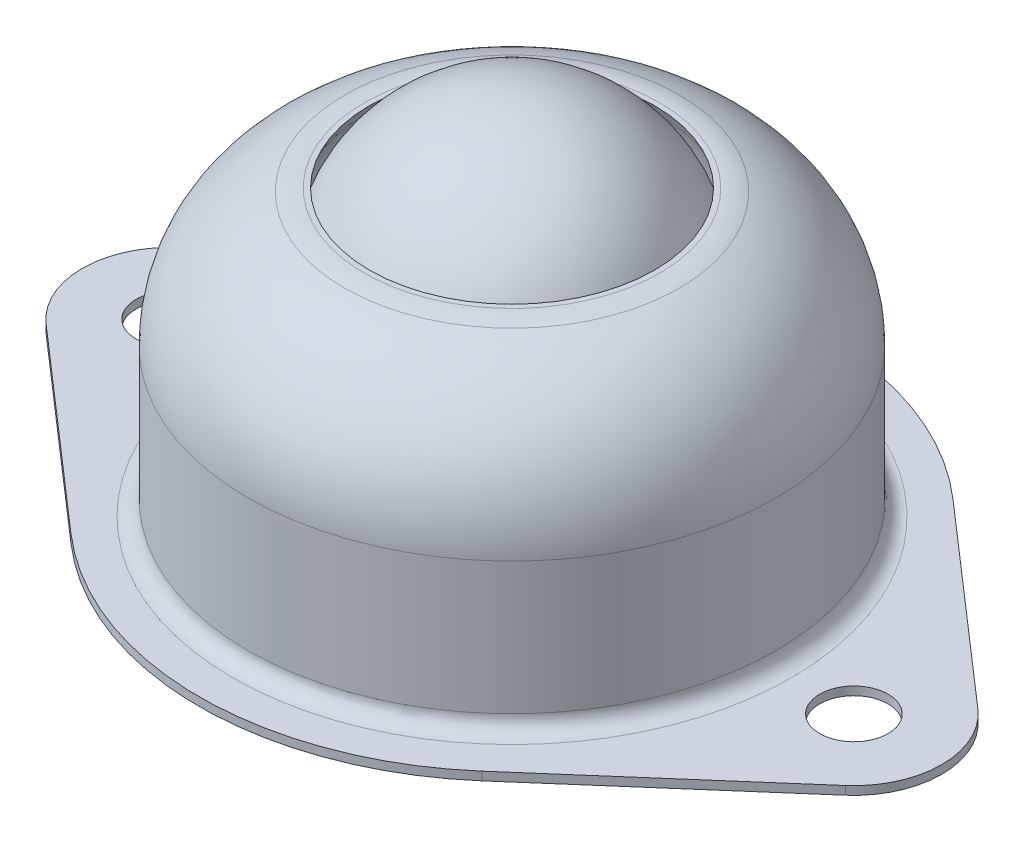
ISO-10303-21;
HEADER;
FILE_DESCRIPTION(('STEP AP214'),'2;1');
FILE_NAME('part.step','',(''),(''),'','','');
FILE_SCHEMA(('AUTOMOTIVE_DESIGN { 1 0 10303 214 1 1 1 1 }'));
ENDSEC;
DATA;
#1=APPLICATION_CONTEXT('core data for automotive mechanical design processes');
#2=APPLICATION_PROTOCOL_DEFINITION('international standard','automotive_design',2000,#1);
#3=PRODUCT_CONTEXT('',#1,'mechanical');
#4=PRODUCT('Part','Part','',(#3));
#5=PRODUCT_RELATED_PRODUCT_CATEGORY('part','',(#4));
#6=PRODUCT_DEFINITION_FORMATION('','',#4);
#7=PRODUCT_DEFINITION_CONTEXT('part definition',#1,'design');
#8=PRODUCT_DEFINITION('design','',#6,#7);
#9=PRODUCT_DEFINITION_SHAPE('','',#8);
#10=(LENGTH_UNIT() NAMED_UNIT(*) SI_UNIT(.MILLI.,.METRE.));
#11=(NAMED_UNIT(*) PLANE_ANGLE_UNIT() SI_UNIT($,.RADIAN.));
#12=(NAMED_UNIT(*) SI_UNIT($,.STERADIAN.) SOLID_ANGLE_UNIT());
#13=UNCERTAINTY_MEASURE_WITH_UNIT(LENGTH_MEASURE(1.E-05),#10,'distance_accuracy_value','');
#14=(GEOMETRIC_REPRESENTATION_CONTEXT(3) GLOBAL_UNCERTAINTY_ASSIGNED_CONTEXT((#13)) GLOBAL_UNIT_ASSIGNED_CONTEXT((#10,
#11,#12)) REPRESENTATION_CONTEXT('',''));
#15=CARTESIAN_POINT('',(0.,0.,0.));
#16=DIRECTION('',(0.,0.,1.));
#17=DIRECTION('',(1.,0.,0.));
#18=AXIS2_PLACEMENT_3D('',#15,#16,#17);
#19=CARTESIAN_POINT('',(0.,17.4625,0.));
#20=DIRECTION('',(0.,1.,0.));
#21=DIRECTION('',(1.,0.,0.));
#22=AXIS2_PLACEMENT_3D('',#19,#20,#21);
#23=SPHERICAL_SURFACE('',#22,13.208);
#24=CARTESIAN_POINT('',(0.,22.9209308176448,0.));
#25=DIRECTION('',(0.,1.,0.));
#26=DIRECTION('',(0.,0.,1.));
#27=AXIS2_PLACEMENT_3D('',#24,#25,#26);
#28=CIRCLE('',#27,12.0273354076863);
#29=CARTESIAN_POINT('',(12.0273354076863,22.9209308176448,0.));
#30=VERTEX_POINT('',#29);
#31=EDGE_CURVE('E72',#30,#30,#28,.T.);
#32=CARTESIAN_POINT('',(0.,4.31569947667876,0.));
#33=DIRECTION('',(0.,1.,0.));
#34=DIRECTION('',(0.,0.,1.));
#35=AXIS2_PLACEMENT_3D('',#32,#33,#34);
#36=CIRCLE('',#35,1.27);
#37=CARTESIAN_POINT('',(1.26999999999999,4.31569947667876,0.));
#38=VERTEX_POINT('',#37);
#39=EDGE_CURVE('E81',#38,#38,#36,.T.);
#40=CARTESIAN_POINT('',(12.0273354076863,22.9209308176448,0.));
#41=CARTESIAN_POINT('',(12.1354063074439,22.6828266231431,0.));
#42=CARTESIAN_POINT('',(12.2363884193767,22.4415063961473,0.));
#43=CARTESIAN_POINT('',(12.4238592792069,21.9533003307347,0.));
#44=CARTESIAN_POINT('',(12.5103480271044,21.7064144923179,0.));
#45=CARTESIAN_POINT('',(12.6685163704782,21.2079436576303,0.));
#46=CARTESIAN_POINT('',(12.7401959659545,20.9563586613596,0.));
#47=CARTESIAN_POINT('',(12.8684961325188,20.4493777941359,0.));
#48=CARTESIAN_POINT('',(12.9251167036067,20.1939819231829,0.));
#49=CARTESIAN_POINT('',(13.0230983831068,19.680279619073,0.));
#50=CARTESIAN_POINT('',(13.064459491519,19.4219731859161,0.));
#51=CARTESIAN_POINT('',(13.1317766005068,18.9033607110477,0.));
#52=CARTESIAN_POINT('',(13.1577326010825,18.6430546693362,0.));
#53=CARTESIAN_POINT('',(13.194147909286,18.1213608811198,0.));
#54=CARTESIAN_POINT('',(13.2046072169139,17.8599731346149,0.));
#55=CARTESIAN_POINT('',(13.2099922711641,17.3370376821296,0.));
#56=CARTESIAN_POINT('',(13.2049180177863,17.0754899761493,0.));
#57=CARTESIAN_POINT('',(13.1792538395225,16.5531569068375,0.));
#58=CARTESIAN_POINT('',(13.1586639146365,16.2923715435061,0.));
#59=CARTESIAN_POINT('',(13.1020410013077,15.7724827752907,0.));
#60=CARTESIAN_POINT('',(13.066008012865,15.5133793704066,0.));
#61=CARTESIAN_POINT('',(12.9786260363631,14.9977682032215,0.));
#62=CARTESIAN_POINT('',(12.9272770483038,14.7412604409204,0.));
#63=CARTESIAN_POINT('',(12.8094441461496,14.2317450900827,0.));
#64=CARTESIAN_POINT('',(12.7429602320547,13.9787375015462,0.));
#65=CARTESIAN_POINT('',(12.5950919220644,13.4771146866122,0.));
#66=CARTESIAN_POINT('',(12.5137075261689,13.2284994602148,0.));
#67=CARTESIAN_POINT('',(12.3363252408624,12.736538069023,0.));
#68=CARTESIAN_POINT('',(12.2403273514514,12.4931919042286,0.));
#69=CARTESIAN_POINT('',(12.0340565994001,12.0126267552514,0.));
#70=CARTESIAN_POINT('',(11.9237837367599,11.7754077710686,0.));
#71=CARTESIAN_POINT('',(11.6893518968121,11.3079334958597,0.));
#72=CARTESIAN_POINT('',(11.5651929195045,11.0776782048335,0.));
#73=CARTESIAN_POINT('',(11.3034266758137,10.6249432721992,0.));
#74=CARTESIAN_POINT('',(11.1658194094304,10.4024636305911,0.));
#75=CARTESIAN_POINT('',(10.877641836292,9.96606453354397,0.));
#76=CARTESIAN_POINT('',(10.727071529537,9.75214507810504,0.));
#77=CARTESIAN_POINT('',(10.4134988363238,9.33362070410242,0.));
#78=CARTESIAN_POINT('',(10.2504964498656,9.12901578553873,0.));
#79=CARTESIAN_POINT('',(9.91263439753766,8.72984198985492,0.));
#80=CARTESIAN_POINT('',(9.73777473166778,8.5352731127348,0.));
#81=CARTESIAN_POINT('',(9.37681473349268,8.15685751411455,0.));
#82=CARTESIAN_POINT('',(9.19071440118745,7.97301079261442,0.));
#83=CARTESIAN_POINT('',(8.80792932142758,7.61668780951829,0.));
#84=CARTESIAN_POINT('',(8.61124457397294,7.44421154792229,0.));
#85=CARTESIAN_POINT('',(8.20798423933021,7.11123769302188,0.));
#86=CARTESIAN_POINT('',(8.00140865214211,6.95074009971748,0.));
#87=CARTESIAN_POINT('',(7.57909509187895,6.64228954865901,0.));
#88=CARTESIAN_POINT('',(7.36335711880388,6.49433659090495,0.));
#89=CARTESIAN_POINT('',(6.9234795499887,6.21149704311178,0.));
#90=CARTESIAN_POINT('',(6.69933995424859,6.07661045307267,0.));
#91=CARTESIAN_POINT('',(6.2434495310656,5.82037929117924,0.));
#92=CARTESIAN_POINT('',(6.01169870362271,5.69903471932493,0.));
#93=CARTESIAN_POINT('',(5.54140304457322,5.4703155106555,0.));
#94=CARTESIAN_POINT('',(5.30285821296662,5.36294087384038,0.));
#95=CARTESIAN_POINT('',(4.81981574275874,5.16254011479224,0.));
#96=CARTESIAN_POINT('',(4.57531810415748,5.0695139925592,0.));
#97=CARTESIAN_POINT('',(4.08123216493327,4.89813852340909,0.));
#98=CARTESIAN_POINT('',(3.83164386431033,4.81978917649202,0.));
#99=CARTESIAN_POINT('',(3.32825686069129,4.67804272306628,0.));
#100=CARTESIAN_POINT('',(3.07445815769519,4.61464561655762,0.));
#101=CARTESIAN_POINT('',(2.56354484673523,4.50303026562589,0.));
#102=CARTESIAN_POINT('',(2.30643023877135,4.45481202120282,0.));
#103=CARTESIAN_POINT('',(1.78979358299367,4.37371299840943,0.));
#104=CARTESIAN_POINT('',(1.53027153517986,4.34083222003912,0.));
#105=CARTESIAN_POINT('',(1.26999999999999,4.31569947667876,0.));
#106=B_SPLINE_CURVE_WITH_KNOTS('',3,(#40,#41,#42,#43,#44,#45,#46,#47,#48,#49,#50,#51,#52,#53,
#54,#55,#56,#57,#58,#59,#60,#61,#62,#63,#64,#65,#66,#67,#68,#69,#70,#71,#72,#73,#74,#75,#76,#77,
#78,#79,#80,#81,#82,#83,#84,#85,#86,#87,#88,#89,#90,#91,#92,#93,#94,#95,#96,#97,#98,#99,#100,
#101,#102,#103,#104,#105),.UNSPECIFIED.,.F.,.F.,(4,2,2,2,2,2,2,2,2,2,2,2,2,2,2,2,2,2,2,2,2,2,2,
2,2,2,2,2,2,2,2,2,4),(0.,0.784329533650566,1.56865906730113,2.3529886009517,3.13731813460227,
3.92164766825284,4.70597720190341,5.49030673555397,6.27463626920454,7.05896580285511,
7.84329533650568,8.62762487015624,9.41195440380681,10.1962839374574,10.9806134711079,
11.7649430047585,12.5492725384091,13.3336020720596,14.1179316057102,14.9022611393608,
15.6865906730114,16.4709202066619,17.2552497403125,18.0395792739631,18.8239088076136,
19.6082383412642,20.3925678749148,21.1768974085653,21.9612269422159,22.7455564758665,
23.529886009517,24.3142155431676,25.0985450768182),.UNSPECIFIED.);
#107=EDGE_CURVE('BSEAM52',#30,#38,#106,.T.);
#108=ORIENTED_EDGE('',*,*,#31,.T.);
#109=ORIENTED_EDGE('',*,*,#39,.F.);
#110=ORIENTED_EDGE('',*,*,#107,.T.);
#111=ORIENTED_EDGE('',*,*,#107,.F.);
#112=EDGE_LOOP('',(#108,#110,#109,#111));
#113=FACE_BOUND('',#112,.T.);
#114=ADVANCED_FACE('F52',(#113),#23,.F.);
#115=CARTESIAN_POINT('',(0.,17.4625,0.));
#116=DIRECTION('',(0.,1.,0.));
#117=DIRECTION('',(-1.,0.,0.));
#118=AXIS2_PLACEMENT_3D('',#115,#116,#117);
#119=SPHERICAL_SURFACE('',#118,13.8938);
#120=CARTESIAN_POINT('',(0.,16.2531747527013,0.));
#121=DIRECTION('',(0.,1.,0.));
#122=DIRECTION('',(0.,0.,1.));
#123=AXIS2_PLACEMENT_3D('',#120,#121,#122);
#124=CIRCLE('',#123,13.841069716111);
#125=CARTESIAN_POINT('',(-13.841069716111,16.2531747527013,0.));
#126=VERTEX_POINT('',#125);
#127=EDGE_CURVE('E14',#126,#126,#124,.F.);
#128=CARTESIAN_POINT('',(0.,3.626865629289,0.));
#129=DIRECTION('',(0.,1.,0.));
#130=DIRECTION('',(0.,0.,1.));
#131=AXIS2_PLACEMENT_3D('',#128,#129,#130);
#132=CIRCLE('',#131,1.27);
#133=CARTESIAN_POINT('',(-1.26999999999999,3.626865629289,0.));
#134=VERTEX_POINT('',#133);
#135=EDGE_CURVE('E56',#134,#134,#132,.F.);
#136=CARTESIAN_POINT('',(-13.841069716111,16.2531747527013,0.));
#137=CARTESIAN_POINT('',(-13.8235360683736,16.052463004573,0.));
#138=CARTESIAN_POINT('',(-13.8016308000787,15.8521334399351,0.));
#139=CARTESIAN_POINT('',(-13.7491314395764,15.4526160474631,0.));
#140=CARTESIAN_POINT('',(-13.7185373473692,15.253428219629,0.));
#141=CARTESIAN_POINT('',(-13.6487147562452,14.8565716705877,0.));
#142=CARTESIAN_POINT('',(-13.6094862573285,14.6589029493804,0.));
#143=CARTESIAN_POINT('',(-13.5224700139171,14.2654585299939,0.));
#144=CARTESIAN_POINT('',(-13.4746822694224,14.0696828318147,0.));
#145=CARTESIAN_POINT('',(-13.3706377117815,13.6803949479255,0.));
#146=CARTESIAN_POINT('',(-13.3143808986352,13.4868827622155,0.));
#147=CARTESIAN_POINT('',(-13.1935047225155,13.1024880680105,0.));
#148=CARTESIAN_POINT('',(-13.128885359542,12.9116055595156,0.));
#149=CARTESIAN_POINT('',(-12.9914063418791,12.5328314196153,0.));
#150=CARTESIAN_POINT('',(-12.9185466871896,12.34493978821,0.));
#151=CARTESIAN_POINT('',(-12.7647249596114,11.9725029398908,0.));
#152=CARTESIAN_POINT('',(-12.6837628867227,11.7879577229769,0.));
#153=CARTESIAN_POINT('',(-12.5138895219825,11.4225629095876,0.));
#154=CARTESIAN_POINT('',(-12.424978230131,11.2417133131122,0.));
#155=CARTESIAN_POINT('',(-12.2393746702459,10.8840519532928,0.));
#156=CARTESIAN_POINT('',(-12.1426824022123,10.7072401899489,0.));
#157=CARTESIAN_POINT('',(-11.9416998558625,10.3579890685513,0.));
#158=CARTESIAN_POINT('',(-11.8374095775463,10.1855497104977,0.));
#159=CARTESIAN_POINT('',(-11.621428353987,9.84536969813801,0.));
#160=CARTESIAN_POINT('',(-11.5097374087438,9.67762904383196,0.));
#161=CARTESIAN_POINT('',(-11.2791661985701,9.34716384630439,0.));
#162=CARTESIAN_POINT('',(-11.1602859336395,9.18443930308288,0.));
#163=CARTESIAN_POINT('',(-10.9155610353331,8.86431424332153,0.));
#164=CARTESIAN_POINT('',(-10.7897164019572,8.70691372678169,0.));
#165=CARTESIAN_POINT('',(-10.5313008963293,8.39773456158905,0.));
#166=CARTESIAN_POINT('',(-10.3987300240772,8.24595591293624,0.));
#167=CARTESIAN_POINT('',(-10.1271128979956,7.9483076867406,0.));
#168=CARTESIAN_POINT('',(-9.98806664416616,7.80243810919777,0.));
#169=CARTESIAN_POINT('',(-9.70376186527229,7.51688404700234,0.));
#170=CARTESIAN_POINT('',(-9.55850334020791,7.37719956234975,0.));
#171=CARTESIAN_POINT('',(-9.26204888436017,7.10428000396994,0.));
#172=CARTESIAN_POINT('',(-9.1108529535768,6.97104493024272,0.));
#173=CARTESIAN_POINT('',(-8.80280978686588,6.71127630784794,0.));
#174=CARTESIAN_POINT('',(-8.64596255093832,6.58474275918037,0.));
#175=CARTESIAN_POINT('',(-8.32691356819881,6.33861662007447,0.));
#176=CARTESIAN_POINT('',(-8.16471182138687,6.21902402963613,0.));
#177=CARTESIAN_POINT('',(-7.83526074321399,5.98700610612886,0.));
#178=CARTESIAN_POINT('',(-7.66801141185305,5.87458077305992,0.));
#179=CARTESIAN_POINT('',(-7.32878164221306,5.65711010117693,0.));
#180=CARTESIAN_POINT('',(-7.15680120393401,5.55206476236288,0.));
#181=CARTESIAN_POINT('',(-6.80843465052383,5.3495528511087,0.));
#182=CARTESIAN_POINT('',(-6.6320485353927,5.25208627866857,0.));
#183=CARTESIAN_POINT('',(-6.27520439500448,5.06491633123989,0.));
#184=CARTESIAN_POINT('',(-6.0947463697474,4.97521295625132,0.));
#185=CARTESIAN_POINT('',(-5.73009988084804,4.8037391453258,0.));
#186=CARTESIAN_POINT('',(-5.54591141720576,4.72196870938884,0.));
#187=CARTESIAN_POINT('',(-5.17415258242203,4.56651550542922,0.));
#188=CARTESIAN_POINT('',(-4.98658221128058,4.49283273740656,0.));
#189=CARTESIAN_POINT('',(-4.60841449097444,4.353694300326,0.));
#190=CARTESIAN_POINT('',(-4.41781714180974,4.28823863126809,0.));
#191=CARTESIAN_POINT('',(-4.03395612581727,4.16567823273946,0.));
#192=CARTESIAN_POINT('',(-3.8406924589895,4.10857350326875,0.));
#193=CARTESIAN_POINT('',(-3.45186450186384,4.00282310716967,0.));
#194=CARTESIAN_POINT('',(-3.25630021156596,3.95417744054131,0.));
#195=CARTESIAN_POINT('',(-2.86324109799787,3.8654369706031,0.));
#196=CARTESIAN_POINT('',(-2.66574627472766,3.82534216729326,0.));
#197=CARTESIAN_POINT('',(-2.26919967847707,3.75378022384315,0.));
#198=CARTESIAN_POINT('',(-2.07014790549668,3.72231308370289,0.));
#199=CARTESIAN_POINT('',(-1.67086453742834,3.66806253785535,0.));
#200=CARTESIAN_POINT('',(-1.47063294234039,3.64527913214808,0.));
#201=CARTESIAN_POINT('',(-1.26999999999999,3.626865629289,0.));
#202=B_SPLINE_CURVE_WITH_KNOTS('',3,(#136,#137,#138,#139,#140,#141,#142,#143,#144,#145,#146,
#147,#148,#149,#150,#151,#152,#153,#154,#155,#156,#157,#158,#159,#160,#161,#162,#163,#164,#165,
#166,#167,#168,#169,#170,#171,#172,#173,#174,#175,#176,#177,#178,#179,#180,#181,#182,#183,#184,
#185,#186,#187,#188,#189,#190,#191,#192,#193,#194,#195,#196,#197,#198,#199,#200,#201),
.UNSPECIFIED.,.F.,.F.,(4,2,2,2,2,2,2,2,2,2,2,2,2,2,2,2,2,2,2,2,2,2,2,2,2,2,2,2,2,2,2,2,4),(0.,
0.604380378982275,1.20876075796455,1.81314113694683,2.41752151592911,3.02190189491138,
3.62628227389366,4.23066265287594,4.83504303185821,5.43942341084049,6.04380378982277,
6.64818416880504,7.25256454778732,7.8569449267696,8.46132530575188,9.06570568473415,
9.67008606371643,10.2744664426987,10.878846821681,11.4832272006633,12.0876075796455,
12.6919879586278,13.2963683376101,13.9007487165924,14.5051290955746,15.1095094745569,
15.7138898535392,16.3182702325215,16.9226506115038,17.527030990486,18.1314113694683,
18.7357917484506,19.3401721274329),.UNSPECIFIED.);
#203=EDGE_CURVE('BSEAM90',#126,#134,#202,.T.);
#204=ORIENTED_EDGE('',*,*,#127,.T.);
#205=ORIENTED_EDGE('',*,*,#135,.F.);
#206=ORIENTED_EDGE('',*,*,#203,.T.);
#207=ORIENTED_EDGE('',*,*,#203,.F.);
#208=EDGE_LOOP('',(#204,#206,#205,#207));
#209=FACE_BOUND('',#208,.T.);
#210=ADVANCED_FACE('F90',(#209),#119,.T.);
#211=CARTESIAN_POINT('',(20.41525,0.6858,0.));
#212=DIRECTION('',(0.,1.,0.));
#213=DIRECTION('',(0.,0.,1.));
#214=AXIS2_PLACEMENT_3D('',#211,#212,#213);
#215=PLANE('',#214);
#216=CARTESIAN_POINT('',(0.,0.6858,0.));
#217=DIRECTION('',(0.,1.,0.));
#218=DIRECTION('',(0.,0.,1.));
#219=AXIS2_PLACEMENT_3D('',#216,#217,#218);
#220=CIRCLE('',#219,20.41525);
#221=CARTESIAN_POINT('',(0.,0.6858,20.41525));
#222=VERTEX_POINT('',#221);
#223=EDGE_CURVE('E64',#222,#222,#220,.T.);
#224=ORIENTED_EDGE('',*,*,#223,.F.);
#225=EDGE_LOOP('',(#224));
#226=FACE_BOUND('',#225,.T.);
#227=CARTESIAN_POINT('',(0.,0.6858,0.));
#228=DIRECTION('',(0.,1.,0.));
#229=DIRECTION('',(0.,0.,1.));
#230=AXIS2_PLACEMENT_3D('',#227,#228,#229);
#231=CIRCLE('',#230,19.72945);
#232=CARTESIAN_POINT('',(0.,0.6858,19.72945));
#233=VERTEX_POINT('',#232);
#234=EDGE_CURVE('E78',#233,#233,#231,.T.);
#235=ORIENTED_EDGE('',*,*,#234,.T.);
#236=EDGE_LOOP('',(#235));
#237=FACE_BOUND('',#236,.T.);
#238=ADVANCED_FACE('F92',(#226,#237),#215,.F.);
#239=CARTESIAN_POINT('',(0.,23.8125,0.));
#240=DIRECTION('',(0.,1.,0.));
#241=DIRECTION('',(0.,0.,1.));
#242=AXIS2_PLACEMENT_3D('',#239,#240,#241);
#243=CYLINDRICAL_SURFACE('',#242,20.41525);
#244=CARTESIAN_POINT('',(0.,12.7,0.));
#245=DIRECTION('',(0.,1.,0.));
#246=DIRECTION('',(0.,0.,1.));
#247=AXIS2_PLACEMENT_3D('',#244,#245,#246);
#248=CIRCLE('',#247,20.41525);
#249=CARTESIAN_POINT('',(0.,12.7,20.41525));
#250=VERTEX_POINT('',#249);
#251=EDGE_CURVE('E69',#250,#250,#248,.T.);
#252=ORIENTED_EDGE('',*,*,#251,.F.);
#253=EDGE_LOOP('',(#252));
#254=FACE_BOUND('',#253,.T.);
#255=ORIENTED_EDGE('',*,*,#223,.T.);
#256=EDGE_LOOP('',(#255));
#257=FACE_BOUND('',#256,.T.);
#258=ADVANCED_FACE('F98',(#254,#257),#243,.T.);
#259=CARTESIAN_POINT('',(0.,12.7,0.));
#260=DIRECTION('',(0.,1.,0.));
#261=DIRECTION('',(0.,0.,1.));
#262=AXIS2_PLACEMENT_3D('',#259,#260,#261);
#263=DEGENERATE_TOROIDAL_SURFACE('',#262,9.99403409090909,10.4212159090909,.T.);
#264=ORIENTED_EDGE('',*,*,#31,.F.);
#265=EDGE_LOOP('',(#264));
#266=FACE_BOUND('',#265,.T.);
#267=ORIENTED_EDGE('',*,*,#251,.T.);
#268=EDGE_LOOP('',(#267));
#269=FACE_BOUND('',#268,.T.);
#270=ADVANCED_FACE('F106',(#266,#269),#263,.T.);
#271=CARTESIAN_POINT('',(0.,12.7,0.));
#272=DIRECTION('',(0.,1.,0.));
#273=DIRECTION('',(0.,0.,1.));
#274=AXIS2_PLACEMENT_3D('',#271,#272,#273);
#275=TOROIDAL_SURFACE('',#274,9.99403409090909,9.73541590909091);
#276=CARTESIAN_POINT('',(0.,17.2083282561458,0.));
#277=DIRECTION('',(0.,-1.,0.));
#278=DIRECTION('',(0.,0.,-1.));
#279=AXIS2_PLACEMENT_3D('',#276,#277,#278);
#280=CIRCLE('',#279,18.6226666162759);
#281=CARTESIAN_POINT('',(0.,17.2083282561458,-18.6226666162759));
#282=VERTEX_POINT('',#281);
#283=EDGE_CURVE('E60',#282,#282,#280,.F.);
#284=ORIENTED_EDGE('',*,*,#283,.T.);
#285=EDGE_LOOP('',(#284));
#286=FACE_BOUND('',#285,.T.);
#287=CARTESIAN_POINT('',(0.,12.7,0.));
#288=DIRECTION('',(0.,1.,0.));
#289=DIRECTION('',(0.,0.,1.));
#290=AXIS2_PLACEMENT_3D('',#287,#288,#289);
#291=CIRCLE('',#290,19.72945);
#292=CARTESIAN_POINT('',(0.,12.7,19.72945));
#293=VERTEX_POINT('',#292);
#294=EDGE_CURVE('E75',#293,#293,#291,.T.);
#295=ORIENTED_EDGE('',*,*,#294,.F.);
#296=EDGE_LOOP('',(#295));
#297=FACE_BOUND('',#296,.T.);
#298=ADVANCED_FACE('F103',(#286,#297),#275,.F.);
#299=CARTESIAN_POINT('',(0.,23.8125,0.));
#300=DIRECTION('',(0.,1.,0.));
#301=DIRECTION('',(0.,0.,1.));
#302=AXIS2_PLACEMENT_3D('',#299,#300,#301);
#303=CYLINDRICAL_SURFACE('',#302,19.72945);
#304=ORIENTED_EDGE('',*,*,#234,.F.);
#305=EDGE_LOOP('',(#304));
#306=FACE_BOUND('',#305,.T.);
#307=ORIENTED_EDGE('',*,*,#294,.T.);
#308=EDGE_LOOP('',(#307));
#309=FACE_BOUND('',#308,.T.);
#310=ADVANCED_FACE('F120',(#306,#309),#303,.F.);
#311=CARTESIAN_POINT('',(0.,16.0320915265041,0.));
#312=DIRECTION('',(0.,1.,0.));
#313=DIRECTION('',(0.,0.,1.));
#314=AXIS2_PLACEMENT_3D('',#311,#312,#313);
#315=TOROIDAL_SURFACE('',#314,16.371429810464,2.54);
#316=ORIENTED_EDGE('',*,*,#127,.F.);
#317=EDGE_LOOP('',(#316));
#318=FACE_BOUND('',#317,.T.);
#319=ORIENTED_EDGE('',*,*,#283,.F.);
#320=EDGE_LOOP('',(#319));
#321=FACE_BOUND('',#320,.T.);
#322=ADVANCED_FACE('F54',(#318,#321),#315,.F.);
#323=CARTESIAN_POINT('',(0.,23.8125,0.));
#324=DIRECTION('',(0.,1.,0.));
#325=DIRECTION('',(0.,0.,1.));
#326=AXIS2_PLACEMENT_3D('',#323,#324,#325);
#327=CYLINDRICAL_SURFACE('',#326,1.27);
#328=ORIENTED_EDGE('',*,*,#135,.T.);
#329=EDGE_LOOP('',(#328));
#330=FACE_BOUND('',#329,.T.);
#331=ORIENTED_EDGE('',*,*,#39,.T.);
#332=EDGE_LOOP('',(#331));
#333=FACE_BOUND('',#332,.T.);
#334=ADVANCED_FACE('F88',(#330,#333),#327,.F.);
#335=CLOSED_SHELL('',(#114,#210,#238,#258,#270,#298,#310,#322,#334));
#336=MANIFOLD_SOLID_BREP('B2',#335);
#337=CARTESIAN_POINT('',(0.,17.4625,0.));
#338=DIRECTION('',(0.,1.,0.));
#339=DIRECTION('',(-1.,0.,0.));
#340=AXIS2_PLACEMENT_3D('',#337,#338,#339);
#341=SPHERICAL_SURFACE('',#340,12.7);
#342=CARTESIAN_POINT('',(0.,30.1625,0.));
#343=VERTEX_POINT('',#342);
#344=VERTEX_LOOP('',#343);
#345=FACE_BOUND('',#344,.T.);
#346=ADVANCED_FACE('F198',(#345),#341,.T.);
#347=CLOSED_SHELL('',(#346));
#348=MANIFOLD_SOLID_BREP('B9',#347);
#349=CARTESIAN_POINT('',(0.,0.,0.));
#350=DIRECTION('',(0.,1.,0.));
#351=DIRECTION('',(0.,0.,1.));
#352=AXIS2_PLACEMENT_3D('',#349,#350,#351);
#353=PLANE('',#352);
#354=CARTESIAN_POINT('',(0.,0.,0.));
#355=DIRECTION('',(0.,1.,0.));
#356=DIRECTION('',(0.,0.,1.));
#357=AXIS2_PLACEMENT_3D('',#354,#355,#356);
#358=CIRCLE('',#357,22.32025);
#359=CARTESIAN_POINT('',(0.,0.,22.32025));
#360=VERTEX_POINT('',#359);
#361=EDGE_CURVE('E196',#360,#360,#358,.T.);
#362=ORIENTED_EDGE('',*,*,#361,.T.);
#363=EDGE_LOOP('',(#362));
#364=FACE_BOUND('',#363,.T.);
#365=CARTESIAN_POINT('',(0.,0.,0.));
#366=DIRECTION('',(0.,1.,0.));
#367=DIRECTION('',(0.,0.,1.));
#368=AXIS2_PLACEMENT_3D('',#365,#366,#367);
#369=CIRCLE('',#368,25.4);
#370=CARTESIAN_POINT('',(-16.6914285714286,0.,19.1456577908647));
#371=VERTEX_POINT('',#370);
#372=CARTESIAN_POINT('',(16.6914285714286,0.,19.1456577908647));
#373=VERTEX_POINT('',#372);
#374=EDGE_CURVE('E310',#371,#373,#369,.T.);
#375=ORIENTED_EDGE('',*,*,#374,.F.);
#376=DIRECTION('',(0.753766054758452,0.,0.657142857142858));
#377=VECTOR('',#376,1.);
#378=CARTESIAN_POINT('',(-32.4757142857143,0.,5.38471625368069));
#379=LINE('',#378,#377);
#380=CARTESIAN_POINT('',(-32.4757142857143,0.,5.38471625368069));
#381=VERTEX_POINT('',#380);
#382=EDGE_CURVE('E263',#381,#371,#379,.T.);
#383=ORIENTED_EDGE('',*,*,#382,.F.);
#384=CARTESIAN_POINT('',(-27.78125,0.,0.));
#385=DIRECTION('',(0.,1.,0.));
#386=DIRECTION('',(0.,0.,1.));
#387=AXIS2_PLACEMENT_3D('',#384,#385,#386);
#388=CIRCLE('',#387,7.14374999999999);
#389=CARTESIAN_POINT('',(-32.4757142857143,0.,-5.38471625368069));
#390=VERTEX_POINT('',#389);
#391=EDGE_CURVE('E257',#390,#381,#388,.T.);
#392=ORIENTED_EDGE('',*,*,#391,.F.);
#393=DIRECTION('',(-0.753766054758452,0.,0.657142857142857));
#394=VECTOR('',#393,1.);
#395=CARTESIAN_POINT('',(-16.6914285714286,0.,-19.1456577908647));
#396=LINE('',#395,#394);
#397=CARTESIAN_POINT('',(-16.6914285714286,0.,-19.1456577908647));
#398=VERTEX_POINT('',#397);
#399=EDGE_CURVE('E300',#398,#390,#396,.T.);
#400=ORIENTED_EDGE('',*,*,#399,.F.);
#401=CARTESIAN_POINT('',(0.,0.,0.));
#402=DIRECTION('',(0.,1.,0.));
#403=DIRECTION('',(0.,0.,1.));
#404=AXIS2_PLACEMENT_3D('',#401,#402,#403);
#405=CIRCLE('',#404,25.4);
#406=CARTESIAN_POINT('',(16.6914285714286,0.,-19.1456577908647));
#407=VERTEX_POINT('',#406);
#408=EDGE_CURVE('E320',#407,#398,#405,.T.);
#409=ORIENTED_EDGE('',*,*,#408,.F.);
#410=DIRECTION('',(-0.753766054758453,0.,-0.657142857142857));
#411=VECTOR('',#410,1.);
#412=CARTESIAN_POINT('',(32.4757142857143,0.,-5.3847162536807));
#413=LINE('',#412,#411);
#414=CARTESIAN_POINT('',(32.4757142857143,0.,-5.3847162536807));
#415=VERTEX_POINT('',#414);
#416=EDGE_CURVE('E318',#415,#407,#413,.T.);
#417=ORIENTED_EDGE('',*,*,#416,.F.);
#418=CARTESIAN_POINT('',(27.78125,0.,0.));
#419=DIRECTION('',(0.,1.,0.));
#420=DIRECTION('',(0.,0.,1.));
#421=AXIS2_PLACEMENT_3D('',#418,#419,#420);
#422=CIRCLE('',#421,7.14374999999999);
#423=CARTESIAN_POINT('',(32.4757142857143,0.,5.38471625368068));
#424=VERTEX_POINT('',#423);
#425=EDGE_CURVE('E316',#424,#415,#422,.T.);
#426=ORIENTED_EDGE('',*,*,#425,.F.);
#427=DIRECTION('',(0.753766054758452,0.,-0.657142857142858));
#428=VECTOR('',#427,1.);
#429=CARTESIAN_POINT('',(16.6914285714286,0.,19.1456577908647));
#430=LINE('',#429,#428);
#431=EDGE_CURVE('E313',#373,#424,#430,.T.);
#432=ORIENTED_EDGE('',*,*,#431,.F.);
#433=EDGE_LOOP('',(#375,#383,#392,#400,#409,#417,#426,#432));
#434=FACE_BOUND('',#433,.T.);
#435=CARTESIAN_POINT('',(-27.78125,0.,0.));
#436=DIRECTION('',(0.,1.,0.));
#437=DIRECTION('',(0.,0.,1.));
#438=AXIS2_PLACEMENT_3D('',#435,#436,#437);
#439=CIRCLE('',#438,2.778125);
#440=CARTESIAN_POINT('',(-27.78125,0.,2.778125));
#441=VERTEX_POINT('',#440);
#442=EDGE_CURVE('E459',#441,#441,#439,.T.);
#443=ORIENTED_EDGE('',*,*,#442,.T.);
#444=EDGE_LOOP('',(#443));
#445=FACE_BOUND('',#444,.T.);
#446=CARTESIAN_POINT('',(27.78125,0.,0.));
#447=DIRECTION('',(0.,1.,0.));
#448=DIRECTION('',(0.,0.,1.));
#449=AXIS2_PLACEMENT_3D('',#446,#447,#448);
#450=CIRCLE('',#449,2.778125);
#451=CARTESIAN_POINT('',(27.78125,0.,2.77812499999999));
#452=VERTEX_POINT('',#451);
#453=EDGE_CURVE('E465',#452,#452,#450,.T.);
#454=ORIENTED_EDGE('',*,*,#453,.T.);
#455=EDGE_LOOP('',(#454));
#456=FACE_BOUND('',#455,.T.);
#457=ADVANCED_FACE('F211',(#364,#434,#445,#456),#353,.F.);
#458=CARTESIAN_POINT('',(0.,0.6858,0.));
#459=DIRECTION('',(0.,1.,0.));
#460=DIRECTION('',(0.,0.,1.));
#461=AXIS2_PLACEMENT_3D('',#458,#459,#460);
#462=PLANE('',#461);
#463=CARTESIAN_POINT('',(0.,0.6858,0.));
#464=DIRECTION('',(0.,1.,0.));
#465=DIRECTION('',(0.,0.,1.));
#466=AXIS2_PLACEMENT_3D('',#463,#464,#465);
#467=CIRCLE('',#466,22.70125);
#468=CARTESIAN_POINT('',(0.,0.6858,22.70125));
#469=VERTEX_POINT('',#468);
#470=EDGE_CURVE('E340',#469,#469,#467,.F.);
#471=ORIENTED_EDGE('',*,*,#470,.T.);
#472=EDGE_LOOP('',(#471));
#473=FACE_BOUND('',#472,.T.);
#474=CARTESIAN_POINT('',(27.78125,0.6858,0.));
#475=DIRECTION('',(0.,1.,0.));
#476=DIRECTION('',(0.,0.,1.));
#477=AXIS2_PLACEMENT_3D('',#474,#475,#476);
#478=CIRCLE('',#477,2.778125);
#479=CARTESIAN_POINT('',(27.78125,0.6858,2.77812499999999));
#480=VERTEX_POINT('',#479);
#481=EDGE_CURVE('E461',#480,#480,#478,.T.);
#482=ORIENTED_EDGE('',*,*,#481,.F.);
#483=EDGE_LOOP('',(#482));
#484=FACE_BOUND('',#483,.T.);
#485=CARTESIAN_POINT('',(0.,0.6858,0.));
#486=DIRECTION('',(0.,1.,0.));
#487=DIRECTION('',(0.,0.,1.));
#488=AXIS2_PLACEMENT_3D('',#485,#486,#487);
#489=CIRCLE('',#488,25.4);
#490=CARTESIAN_POINT('',(-16.6914285714286,0.6858,19.1456577908647));
#491=VERTEX_POINT('',#490);
#492=CARTESIAN_POINT('',(16.6914285714286,0.6858,19.1456577908647));
#493=VERTEX_POINT('',#492);
#494=EDGE_CURVE('E325',#491,#493,#489,.T.);
#495=ORIENTED_EDGE('',*,*,#494,.T.);
#496=DIRECTION('',(0.753766054758452,0.,-0.657142857142858));
#497=VECTOR('',#496,1.);
#498=CARTESIAN_POINT('',(16.6914285714286,0.6858,19.1456577908647));
#499=LINE('',#498,#497);
#500=CARTESIAN_POINT('',(32.4757142857143,0.6858,5.38471625368068));
#501=VERTEX_POINT('',#500);
#502=EDGE_CURVE('E272',#493,#501,#499,.T.);
#503=ORIENTED_EDGE('',*,*,#502,.T.);
#504=CARTESIAN_POINT('',(27.78125,0.6858,0.));
#505=DIRECTION('',(0.,1.,0.));
#506=DIRECTION('',(0.,0.,1.));
#507=AXIS2_PLACEMENT_3D('',#504,#505,#506);
#508=CIRCLE('',#507,7.14374999999999);
#509=CARTESIAN_POINT('',(32.4757142857143,0.6858,-5.3847162536807));
#510=VERTEX_POINT('',#509);
#511=EDGE_CURVE('E471',#501,#510,#508,.T.);
#512=ORIENTED_EDGE('',*,*,#511,.T.);
#513=DIRECTION('',(-0.753766054758453,0.,-0.657142857142857));
#514=VECTOR('',#513,1.);
#515=CARTESIAN_POINT('',(32.4757142857143,0.6858,-5.3847162536807));
#516=LINE('',#515,#514);
#517=CARTESIAN_POINT('',(16.6914285714286,0.6858,-19.1456577908647));
#518=VERTEX_POINT('',#517);
#519=EDGE_CURVE('E473',#510,#518,#516,.T.);
#520=ORIENTED_EDGE('',*,*,#519,.T.);
#521=CARTESIAN_POINT('',(0.,0.6858,0.));
#522=DIRECTION('',(0.,1.,0.));
#523=DIRECTION('',(0.,0.,1.));
#524=AXIS2_PLACEMENT_3D('',#521,#522,#523);
#525=CIRCLE('',#524,25.4);
#526=CARTESIAN_POINT('',(-16.6914285714286,0.6858,-19.1456577908647));
#527=VERTEX_POINT('',#526);
#528=EDGE_CURVE('E292',#518,#527,#525,.T.);
#529=ORIENTED_EDGE('',*,*,#528,.T.);
#530=DIRECTION('',(-0.753766054758452,0.,0.657142857142857));
#531=VECTOR('',#530,1.);
#532=CARTESIAN_POINT('',(-16.6914285714286,0.6858,-19.1456577908647));
#533=LINE('',#532,#531);
#534=CARTESIAN_POINT('',(-32.4757142857143,0.6858,-5.38471625368069));
#535=VERTEX_POINT('',#534);
#536=EDGE_CURVE('E285',#527,#535,#533,.T.);
#537=ORIENTED_EDGE('',*,*,#536,.T.);
#538=CARTESIAN_POINT('',(-27.78125,0.6858,0.));
#539=DIRECTION('',(0.,1.,0.));
#540=DIRECTION('',(0.,0.,1.));
#541=AXIS2_PLACEMENT_3D('',#538,#539,#540);
#542=CIRCLE('',#541,7.14374999999999);
#543=CARTESIAN_POINT('',(-32.4757142857143,0.6858,5.38471625368069));
#544=VERTEX_POINT('',#543);
#545=EDGE_CURVE('E290',#535,#544,#542,.T.);
#546=ORIENTED_EDGE('',*,*,#545,.T.);
#547=DIRECTION('',(0.753766054758452,0.,0.657142857142858));
#548=VECTOR('',#547,1.);
#549=CARTESIAN_POINT('',(-32.4757142857143,0.6858,5.38471625368069));
#550=LINE('',#549,#548);
#551=EDGE_CURVE('E228',#544,#491,#550,.T.);
#552=ORIENTED_EDGE('',*,*,#551,.T.);
#553=EDGE_LOOP('',(#495,#503,#512,#520,#529,#537,#546,#552));
#554=FACE_BOUND('',#553,.T.);
#555=CARTESIAN_POINT('',(-27.78125,0.6858,0.));
#556=DIRECTION('',(0.,1.,0.));
#557=DIRECTION('',(0.,0.,1.));
#558=AXIS2_PLACEMENT_3D('',#555,#556,#557);
#559=CIRCLE('',#558,2.778125);
#560=CARTESIAN_POINT('',(-27.78125,0.6858,2.778125));
#561=VERTEX_POINT('',#560);
#562=EDGE_CURVE('E314',#561,#561,#559,.T.);
#563=ORIENTED_EDGE('',*,*,#562,.F.);
#564=EDGE_LOOP('',(#563));
#565=FACE_BOUND('',#564,.T.);
#566=ADVANCED_FACE('F287',(#473,#484,#554,#565),#462,.T.);
#567=CARTESIAN_POINT('',(0.,0.6858,0.));
#568=DIRECTION('',(0.,-1.,0.));
#569=DIRECTION('',(0.,0.,-1.));
#570=AXIS2_PLACEMENT_3D('',#567,#568,#569);
#571=CYLINDRICAL_SURFACE('',#570,25.4);
#572=ORIENTED_EDGE('',*,*,#374,.T.);
#573=DIRECTION('',(0.,-1.,0.));
#574=VECTOR('',#573,1.);
#575=CARTESIAN_POINT('',(16.6914285714286,0.6858,19.1456577908647));
#576=LINE('',#575,#574);
#577=EDGE_CURVE('E338',#493,#373,#576,.T.);
#578=ORIENTED_EDGE('',*,*,#577,.F.);
#579=ORIENTED_EDGE('',*,*,#494,.F.);
#580=DIRECTION('',(0.,-1.,0.));
#581=VECTOR('',#580,1.);
#582=CARTESIAN_POINT('',(-16.6914285714286,0.6858,19.1456577908647));
#583=LINE('',#582,#581);
#584=EDGE_CURVE('E306',#491,#371,#583,.T.);
#585=ORIENTED_EDGE('',*,*,#584,.T.);
#586=EDGE_LOOP('',(#572,#578,#579,#585));
#587=FACE_BOUND('',#586,.T.);
#588=ADVANCED_FACE('F381',(#587),#571,.T.);
#589=CARTESIAN_POINT('',(16.6914285714286,0.6858,19.1456577908647));
#590=DIRECTION('',(-0.657142857142858,0.,-0.753766054758452));
#591=DIRECTION('',(-0.753766054758452,0.,0.657142857142858));
#592=AXIS2_PLACEMENT_3D('',#589,#590,#591);
#593=PLANE('',#592);
#594=ORIENTED_EDGE('',*,*,#431,.T.);
#595=DIRECTION('',(0.,-1.,0.));
#596=VECTOR('',#595,1.);
#597=CARTESIAN_POINT('',(32.4757142857143,0.6858,5.38471625368068));
#598=LINE('',#597,#596);
#599=EDGE_CURVE('E335',#501,#424,#598,.T.);
#600=ORIENTED_EDGE('',*,*,#599,.F.);
#601=ORIENTED_EDGE('',*,*,#502,.F.);
#602=ORIENTED_EDGE('',*,*,#577,.T.);
#603=EDGE_LOOP('',(#594,#600,#601,#602));
#604=FACE_BOUND('',#603,.T.);
#605=ADVANCED_FACE('F406',(#604),#593,.F.);
#606=CARTESIAN_POINT('',(27.78125,0.6858,0.));
#607=DIRECTION('',(0.,-1.,0.));
#608=DIRECTION('',(0.,0.,-1.));
#609=AXIS2_PLACEMENT_3D('',#606,#607,#608);
#610=CYLINDRICAL_SURFACE('',#609,7.14374999999999);
#611=ORIENTED_EDGE('',*,*,#425,.T.);
#612=DIRECTION('',(0.,-1.,0.));
#613=VECTOR('',#612,1.);
#614=CARTESIAN_POINT('',(32.4757142857143,0.6858,-5.3847162536807));
#615=LINE('',#614,#613);
#616=EDGE_CURVE('E332',#510,#415,#615,.T.);
#617=ORIENTED_EDGE('',*,*,#616,.F.);
#618=ORIENTED_EDGE('',*,*,#511,.F.);
#619=ORIENTED_EDGE('',*,*,#599,.T.);
#620=EDGE_LOOP('',(#611,#617,#618,#619));
#621=FACE_BOUND('',#620,.T.);
#622=ADVANCED_FACE('F402',(#621),#610,.T.);
#623=CARTESIAN_POINT('',(32.4757142857143,0.6858,-5.3847162536807));
#624=DIRECTION('',(-0.657142857142857,0.,0.753766054758453));
#625=DIRECTION('',(0.753766054758453,0.,0.657142857142857));
#626=AXIS2_PLACEMENT_3D('',#623,#624,#625);
#627=PLANE('',#626);
#628=ORIENTED_EDGE('',*,*,#416,.T.);
#629=DIRECTION('',(0.,-1.,0.));
#630=VECTOR('',#629,1.);
#631=CARTESIAN_POINT('',(16.6914285714286,0.6858,-19.1456577908647));
#632=LINE('',#631,#630);
#633=EDGE_CURVE('E329',#518,#407,#632,.T.);
#634=ORIENTED_EDGE('',*,*,#633,.F.);
#635=ORIENTED_EDGE('',*,*,#519,.F.);
#636=ORIENTED_EDGE('',*,*,#616,.T.);
#637=EDGE_LOOP('',(#628,#634,#635,#636));
#638=FACE_BOUND('',#637,.T.);
#639=ADVANCED_FACE('F398',(#638),#627,.F.);
#640=CARTESIAN_POINT('',(0.,0.6858,0.));
#641=DIRECTION('',(0.,-1.,0.));
#642=DIRECTION('',(0.,0.,-1.));
#643=AXIS2_PLACEMENT_3D('',#640,#641,#642);
#644=CYLINDRICAL_SURFACE('',#643,25.4);
#645=ORIENTED_EDGE('',*,*,#408,.T.);
#646=DIRECTION('',(0.,-1.,0.));
#647=VECTOR('',#646,1.);
#648=CARTESIAN_POINT('',(-16.6914285714286,0.6858,-19.1456577908647));
#649=LINE('',#648,#647);
#650=EDGE_CURVE('E301',#527,#398,#649,.T.);
#651=ORIENTED_EDGE('',*,*,#650,.F.);
#652=ORIENTED_EDGE('',*,*,#528,.F.);
#653=ORIENTED_EDGE('',*,*,#633,.T.);
#654=EDGE_LOOP('',(#645,#651,#652,#653));
#655=FACE_BOUND('',#654,.T.);
#656=ADVANCED_FACE('F395',(#655),#644,.T.);
#657=CARTESIAN_POINT('',(-16.6914285714286,0.6858,-19.1456577908647));
#658=DIRECTION('',(0.657142857142857,0.,0.753766054758452));
#659=DIRECTION('',(0.753766054758452,0.,-0.657142857142857));
#660=AXIS2_PLACEMENT_3D('',#657,#658,#659);
#661=PLANE('',#660);
#662=ORIENTED_EDGE('',*,*,#399,.T.);
#663=DIRECTION('',(0.,-1.,0.));
#664=VECTOR('',#663,1.);
#665=CARTESIAN_POINT('',(-32.4757142857143,0.6858,-5.38471625368069));
#666=LINE('',#665,#664);
#667=EDGE_CURVE('E297',#535,#390,#666,.T.);
#668=ORIENTED_EDGE('',*,*,#667,.F.);
#669=ORIENTED_EDGE('',*,*,#536,.F.);
#670=ORIENTED_EDGE('',*,*,#650,.T.);
#671=EDGE_LOOP('',(#662,#668,#669,#670));
#672=FACE_BOUND('',#671,.T.);
#673=ADVANCED_FACE('F298',(#672),#661,.F.);
#674=CARTESIAN_POINT('',(-27.78125,0.6858,0.));
#675=DIRECTION('',(0.,-1.,0.));
#676=DIRECTION('',(0.,0.,-1.));
#677=AXIS2_PLACEMENT_3D('',#674,#675,#676);
#678=CYLINDRICAL_SURFACE('',#677,7.14374999999999);
#679=ORIENTED_EDGE('',*,*,#391,.T.);
#680=DIRECTION('',(0.,-1.,0.));
#681=VECTOR('',#680,1.);
#682=CARTESIAN_POINT('',(-32.4757142857143,0.6858,5.38471625368069));
#683=LINE('',#682,#681);
#684=EDGE_CURVE('E302',#544,#381,#683,.T.);
#685=ORIENTED_EDGE('',*,*,#684,.F.);
#686=ORIENTED_EDGE('',*,*,#545,.F.);
#687=ORIENTED_EDGE('',*,*,#667,.T.);
#688=EDGE_LOOP('',(#679,#685,#686,#687));
#689=FACE_BOUND('',#688,.T.);
#690=ADVANCED_FACE('F304',(#689),#678,.T.);
#691=CARTESIAN_POINT('',(-32.4757142857143,0.6858,5.38471625368069));
#692=DIRECTION('',(0.657142857142858,0.,-0.753766054758452));
#693=DIRECTION('',(-0.753766054758452,0.,-0.657142857142858));
#694=AXIS2_PLACEMENT_3D('',#691,#692,#693);
#695=PLANE('',#694);
#696=ORIENTED_EDGE('',*,*,#382,.T.);
#697=ORIENTED_EDGE('',*,*,#584,.F.);
#698=ORIENTED_EDGE('',*,*,#551,.F.);
#699=ORIENTED_EDGE('',*,*,#684,.T.);
#700=EDGE_LOOP('',(#696,#697,#698,#699));
#701=FACE_BOUND('',#700,.T.);
#702=ADVANCED_FACE('F387',(#701),#695,.F.);
#703=CARTESIAN_POINT('',(-27.78125,0.6858,0.));
#704=DIRECTION('',(0.,-1.,0.));
#705=DIRECTION('',(0.,0.,-1.));
#706=AXIS2_PLACEMENT_3D('',#703,#704,#705);
#707=CYLINDRICAL_SURFACE('',#706,2.778125);
#708=ORIENTED_EDGE('',*,*,#562,.T.);
#709=EDGE_LOOP('',(#708));
#710=FACE_BOUND('',#709,.T.);
#711=ORIENTED_EDGE('',*,*,#442,.F.);
#712=EDGE_LOOP('',(#711));
#713=FACE_BOUND('',#712,.T.);
#714=ADVANCED_FACE('F390',(#710,#713),#707,.F.);
#715=CARTESIAN_POINT('',(27.78125,0.6858,0.));
#716=DIRECTION('',(0.,-1.,0.));
#717=DIRECTION('',(0.,0.,-1.));
#718=AXIS2_PLACEMENT_3D('',#715,#716,#717);
#719=CYLINDRICAL_SURFACE('',#718,2.778125);
#720=ORIENTED_EDGE('',*,*,#481,.T.);
#721=EDGE_LOOP('',(#720));
#722=FACE_BOUND('',#721,.T.);
#723=ORIENTED_EDGE('',*,*,#453,.F.);
#724=EDGE_LOOP('',(#723));
#725=FACE_BOUND('',#724,.T.);
#726=ADVANCED_FACE('F446',(#722,#725),#719,.F.);
#727=CARTESIAN_POINT('',(0.,12.7,0.));
#728=DIRECTION('',(0.,1.,0.));
#729=DIRECTION('',(0.,0.,1.));
#730=AXIS2_PLACEMENT_3D('',#727,#728,#729);
#731=DEGENERATE_TOROIDAL_SURFACE('',#730,9.99403409090909,11.4372159090909,.T.);
#732=CARTESIAN_POINT('',(0.,23.5530221339387,0.));
#733=DIRECTION('',(0.,-1.,0.));
#734=DIRECTION('',(0.,0.,-1.));
#735=AXIS2_PLACEMENT_3D('',#732,#733,#734);
#736=CIRCLE('',#735,13.6026097533275);
#737=CARTESIAN_POINT('',(0.,23.5530221339387,-13.6026097533275));
#738=VERTEX_POINT('',#737);
#739=EDGE_CURVE('E349',#738,#738,#736,.T.);
#740=ORIENTED_EDGE('',*,*,#739,.T.);
#741=EDGE_LOOP('',(#740));
#742=FACE_BOUND('',#741,.T.);
#743=CARTESIAN_POINT('',(0.,12.7,0.));
#744=DIRECTION('',(0.,1.,0.));
#745=DIRECTION('',(0.,0.,1.));
#746=AXIS2_PLACEMENT_3D('',#743,#744,#745);
#747=CIRCLE('',#746,21.43125);
#748=CARTESIAN_POINT('',(0.,12.7,21.43125));
#749=VERTEX_POINT('',#748);
#750=EDGE_CURVE('E488',#749,#749,#747,.T.);
#751=ORIENTED_EDGE('',*,*,#750,.T.);
#752=EDGE_LOOP('',(#751));
#753=FACE_BOUND('',#752,.T.);
#754=ADVANCED_FACE('F442',(#742,#753),#731,.T.);
#755=CARTESIAN_POINT('',(-12.7,23.8125,0.));
#756=DIRECTION('',(0.,-1.,0.));
#757=DIRECTION('',(0.,0.,-1.));
#758=AXIS2_PLACEMENT_3D('',#755,#756,#757);
#759=PLANE('',#758);
#760=CARTESIAN_POINT('',(0.,23.8125,0.));
#761=DIRECTION('',(0.,-1.,0.));
#762=DIRECTION('',(0.,0.,-1.));
#763=AXIS2_PLACEMENT_3D('',#760,#761,#762);
#764=CIRCLE('',#763,11.5813973250208);
#765=CARTESIAN_POINT('',(11.5813973250208,23.8125,0.));
#766=VERTEX_POINT('',#765);
#767=EDGE_CURVE('E352',#766,#766,#764,.F.);
#768=ORIENTED_EDGE('',*,*,#767,.F.);
#769=EDGE_LOOP('',(#768));
#770=FACE_BOUND('',#769,.T.);
#771=CARTESIAN_POINT('',(0.,23.8125,0.));
#772=DIRECTION('',(0.,-1.,0.));
#773=DIRECTION('',(0.,0.,-1.));
#774=AXIS2_PLACEMENT_3D('',#771,#772,#773);
#775=CIRCLE('',#774,11.9998102162029);
#776=CARTESIAN_POINT('',(0.,23.8125,-11.9998102162029));
#777=VERTEX_POINT('',#776);
#778=EDGE_CURVE('E346',#777,#777,#775,.F.);
#779=ORIENTED_EDGE('',*,*,#778,.T.);
#780=EDGE_LOOP('',(#779));
#781=FACE_BOUND('',#780,.T.);
#782=ADVANCED_FACE('F438',(#770,#781),#759,.F.);
#783=CARTESIAN_POINT('',(0.,23.8125,0.));
#784=DIRECTION('',(0.,1.,0.));
#785=DIRECTION('',(0.,0.,1.));
#786=AXIS2_PLACEMENT_3D('',#783,#784,#785);
#787=CYLINDRICAL_SURFACE('',#786,21.43125);
#788=CARTESIAN_POINT('',(0.,1.9558,0.));
#789=DIRECTION('',(0.,1.,0.));
#790=DIRECTION('',(0.,0.,1.));
#791=AXIS2_PLACEMENT_3D('',#788,#789,#790);
#792=CIRCLE('',#791,21.43125);
#793=CARTESIAN_POINT('',(0.,1.9558,21.43125));
#794=VERTEX_POINT('',#793);
#795=EDGE_CURVE('E343',#794,#794,#792,.T.);
#796=ORIENTED_EDGE('',*,*,#795,.T.);
#797=EDGE_LOOP('',(#796));
#798=FACE_BOUND('',#797,.T.);
#799=ORIENTED_EDGE('',*,*,#750,.F.);
#800=EDGE_LOOP('',(#799));
#801=FACE_BOUND('',#800,.T.);
#802=ADVANCED_FACE('F417',(#798,#801),#787,.T.);
#803=CARTESIAN_POINT('',(0.,1.9558,0.));
#804=DIRECTION('',(0.,1.,0.));
#805=DIRECTION('',(0.,0.,1.));
#806=AXIS2_PLACEMENT_3D('',#803,#804,#805);
#807=TOROIDAL_SURFACE('',#806,22.70125,1.27);
#808=ORIENTED_EDGE('',*,*,#795,.F.);
#809=EDGE_LOOP('',(#808));
#810=FACE_BOUND('',#809,.T.);
#811=ORIENTED_EDGE('',*,*,#470,.F.);
#812=EDGE_LOOP('',(#811));
#813=FACE_BOUND('',#812,.T.);
#814=ADVANCED_FACE('F413',(#810,#813),#807,.F.);
#815=CARTESIAN_POINT('',(0.,18.7325,0.));
#816=DIRECTION('',(0.,-1.,0.));
#817=DIRECTION('',(0.,0.,-1.));
#818=AXIS2_PLACEMENT_3D('',#815,#816,#817);
#819=TOROIDAL_SURFACE('',#818,11.9998102162029,5.08);
#820=ORIENTED_EDGE('',*,*,#739,.F.);
#821=EDGE_LOOP('',(#820));
#822=FACE_BOUND('',#821,.T.);
#823=ORIENTED_EDGE('',*,*,#778,.F.);
#824=EDGE_LOOP('',(#823));
#825=FACE_BOUND('',#824,.T.);
#826=ADVANCED_FACE('F416',(#822,#825),#819,.T.);
#827=CARTESIAN_POINT('',(0.,12.7,0.));
#828=DIRECTION('',(0.,1.,0.));
#829=DIRECTION('',(0.,0.,1.));
#830=AXIS2_PLACEMENT_3D('',#827,#828,#829);
#831=DEGENERATE_TOROIDAL_SURFACE('',#830,9.99403409090909,10.4212159090909,.T.);
#832=CARTESIAN_POINT('',(0.,22.588917707151,0.));
#833=DIRECTION('',(0.,1.,0.));
#834=DIRECTION('',(0.,0.,1.));
#835=AXIS2_PLACEMENT_3D('',#832,#833,#834);
#836=CIRCLE('',#835,13.2820498459026);
#837=CARTESIAN_POINT('',(0.,22.588917707151,13.2820498459026));
#838=VERTEX_POINT('',#837);
#839=EDGE_CURVE('E358',#838,#838,#836,.F.);
#840=ORIENTED_EDGE('',*,*,#839,.F.);
#841=EDGE_LOOP('',(#840));
#842=FACE_BOUND('',#841,.T.);
#843=CARTESIAN_POINT('',(0.,12.7,0.));
#844=DIRECTION('',(0.,1.,0.));
#845=DIRECTION('',(0.,0.,1.));
#846=AXIS2_PLACEMENT_3D('',#843,#844,#845);
#847=CIRCLE('',#846,20.41525);
#848=CARTESIAN_POINT('',(0.,12.7,20.41525));
#849=VERTEX_POINT('',#848);
#850=EDGE_CURVE('E355',#849,#849,#847,.T.);
#851=ORIENTED_EDGE('',*,*,#850,.F.);
#852=EDGE_LOOP('',(#851));
#853=FACE_BOUND('',#852,.T.);
#854=ADVANCED_FACE('F420',(#842,#853),#831,.F.);
#855=CARTESIAN_POINT('',(0.,23.8125,0.));
#856=DIRECTION('',(0.,1.,0.));
#857=DIRECTION('',(0.,0.,1.));
#858=AXIS2_PLACEMENT_3D('',#855,#856,#857);
#859=CYLINDRICAL_SURFACE('',#858,20.41525);
#860=CARTESIAN_POINT('',(0.,1.905,0.));
#861=DIRECTION('',(0.,1.,0.));
#862=DIRECTION('',(0.,0.,1.));
#863=AXIS2_PLACEMENT_3D('',#860,#861,#862);
#864=CIRCLE('',#863,20.41525);
#865=CARTESIAN_POINT('',(0.,1.905,20.41525));
#866=VERTEX_POINT('',#865);
#867=EDGE_CURVE('E220',#866,#866,#864,.F.);
#868=ORIENTED_EDGE('',*,*,#867,.T.);
#869=EDGE_LOOP('',(#868));
#870=FACE_BOUND('',#869,.T.);
#871=ORIENTED_EDGE('',*,*,#850,.T.);
#872=EDGE_LOOP('',(#871));
#873=FACE_BOUND('',#872,.T.);
#874=ADVANCED_FACE('F362',(#870,#873),#859,.F.);
#875=CARTESIAN_POINT('',(0.,18.7325,0.));
#876=DIRECTION('',(0.,-1.,0.));
#877=DIRECTION('',(0.,0.,-1.));
#878=AXIS2_PLACEMENT_3D('',#875,#876,#877);
#879=TOROIDAL_SURFACE('',#878,11.9998102162029,4.064);
#880=ORIENTED_EDGE('',*,*,#839,.T.);
#881=EDGE_LOOP('',(#880));
#882=FACE_BOUND('',#881,.T.);
#883=CARTESIAN_POINT('',(0.,22.795639979116,0.));
#884=DIRECTION('',(0.,1.,0.));
#885=DIRECTION('',(0.,0.,1.));
#886=AXIS2_PLACEMENT_3D('',#883,#884,#885);
#887=CIRCLE('',#886,12.0834135062553);
#888=CARTESIAN_POINT('',(12.0834135062554,22.795639979116,0.));
#889=VERTEX_POINT('',#888);
#890=EDGE_CURVE('E356',#889,#889,#887,.T.);
#891=ORIENTED_EDGE('',*,*,#890,.T.);
#892=EDGE_LOOP('',(#891));
#893=FACE_BOUND('',#892,.T.);
#894=ADVANCED_FACE('F371',(#882,#893),#879,.F.);
#895=CARTESIAN_POINT('',(0.,17.4625,0.));
#896=DIRECTION('',(0.,1.,0.));
#897=DIRECTION('',(1.,0.,0.));
#898=AXIS2_PLACEMENT_3D('',#895,#896,#897);
#899=SPHERICAL_SURFACE('',#898,13.208);
#900=CARTESIAN_POINT('',(11.5813973250208,23.8125,0.));
#901=CARTESIAN_POINT('',(11.587078308836,23.8021387826427,0.));
#902=CARTESIAN_POINT('',(11.5927453881928,23.7917699415673,0.));
#903=CARTESIAN_POINT('',(11.604051697325,23.7710170867582,0.));
#904=CARTESIAN_POINT('',(11.6096909271005,23.7606330730245,0.));
#905=CARTESIAN_POINT('',(11.6209414964057,23.7398499476766,0.));
#906=CARTESIAN_POINT('',(11.6265528359355,23.7294508360624,0.));
#907=CARTESIAN_POINT('',(11.6377475843396,23.7086375898693,0.));
#908=CARTESIAN_POINT('',(11.6433309932139,23.6982234552905,0.));
#909=CARTESIAN_POINT('',(11.6544698400841,23.6773802381846,0.));
#910=CARTESIAN_POINT('',(11.66002527808,23.6669511556575,0.));
#911=CARTESIAN_POINT('',(11.6711081431756,23.646078117781,0.));
#912=CARTESIAN_POINT('',(11.6766355702754,23.6356341624317,0.));
#913=CARTESIAN_POINT('',(11.687662373762,23.6147314541433,0.));
#914=CARTESIAN_POINT('',(11.6931617501489,23.6042727012043,0.));
#915=CARTESIAN_POINT('',(11.704132412595,23.583340473076,0.));
#916=CARTESIAN_POINT('',(11.7096036986543,23.5728669978867,0.));
#917=CARTESIAN_POINT('',(11.7205181410332,23.5519054007033,0.));
#918=CARTESIAN_POINT('',(11.7259612973527,23.5414172787091,0.));
#919=CARTESIAN_POINT('',(11.7368194410424,23.5204264634668,0.));
#920=CARTESIAN_POINT('',(11.7422344284125,23.5099237702187,0.));
#921=CARTESIAN_POINT('',(11.7530361951966,23.4889038881243,0.));
#922=CARTESIAN_POINT('',(11.7584229746107,23.478386699278,0.));
#923=CARTESIAN_POINT('',(11.769168286679,23.4573379017477,0.));
#924=CARTESIAN_POINT('',(11.7745268193334,23.4468062930636,0.));
#925=CARTESIAN_POINT('',(11.7852155992825,23.4257287317217,0.));
#926=CARTESIAN_POINT('',(11.7905458465772,23.4151827790639,0.));
#927=CARTESIAN_POINT('',(11.8011780174106,23.394076605742,0.));
#928=CARTESIAN_POINT('',(11.8064799409494,23.383516385078,0.));
#929=CARTESIAN_POINT('',(11.8170554260786,23.3623817518141,0.));
#930=CARTESIAN_POINT('',(11.8223289876691,23.3518073392141,0.));
#931=CARTESIAN_POINT('',(11.8328477109139,23.3306443982507,0.));
#932=CARTESIAN_POINT('',(11.8380928725683,23.3200558698873,0.));
#933=CARTESIAN_POINT('',(11.8485547581574,23.2988647736711,0.));
#934=CARTESIAN_POINT('',(11.8537714820921,23.2882622058184,0.));
#935=CARTESIAN_POINT('',(11.8641764546636,23.2670431069989,0.));
#936=CARTESIAN_POINT('',(11.8693647033002,23.2564265760322,0.));
#937=CARTESIAN_POINT('',(11.8797126879021,23.2351796274607,0.));
#938=CARTESIAN_POINT('',(11.8848724238673,23.2245492098559,0.));
#939=CARTESIAN_POINT('',(11.8951633459582,23.2032745645841,0.));
#940=CARTESIAN_POINT('',(11.9002945320838,23.1926303369171,0.));
#941=CARTESIAN_POINT('',(11.9105283175333,23.1713281481963,0.));
#942=CARTESIAN_POINT('',(11.9156309168572,23.1606701871425,0.));
#943=CARTESIAN_POINT('',(11.9258074919465,23.1393406084225,0.));
#944=CARTESIAN_POINT('',(11.930881467712,23.1286689907563,0.));
#945=CARTESIAN_POINT('',(11.9410007591345,23.1073121756841,0.));
#946=CARTESIAN_POINT('',(11.9460460747915,23.0966269782781,0.));
#947=CARTESIAN_POINT('',(11.9561080096531,23.075243080697,0.));
#948=CARTESIAN_POINT('',(11.9611246288577,23.0645443805218,0.));
#949=CARTESIAN_POINT('',(11.9711291346776,23.0431335544699,0.));
#950=CARTESIAN_POINT('',(11.9761170212928,23.0324214285933,0.));
#951=CARTESIAN_POINT('',(11.9860640260038,23.0109838283031,0.));
#952=CARTESIAN_POINT('',(11.9910231440995,23.0002583538895,0.));
#953=CARTESIAN_POINT('',(12.0009125760485,22.9787941337861,0.));
#954=CARTESIAN_POINT('',(12.0058428899018,22.9680553880963,0.));
#955=CARTESIAN_POINT('',(12.0156746778507,22.9465647027967,0.));
#956=CARTESIAN_POINT('',(12.0205761519464,22.9358127631869,0.));
#957=CARTESIAN_POINT('',(12.0303502250718,22.9142957674983,0.));
#958=CARTESIAN_POINT('',(12.0352228241014,22.9035307114195,0.));
#959=CARTESIAN_POINT('',(12.0449391119981,22.8819875603401,0.));
#960=CARTESIAN_POINT('',(12.0497828008652,22.8712094653395,0.));
#961=CARTESIAN_POINT('',(12.0594412335337,22.8496403140509,0.));
#962=CARTESIAN_POINT('',(12.064255977335,22.8388492577629,0.));
#963=CARTESIAN_POINT('',(12.0738564852332,22.8172542616523,0.));
#964=CARTESIAN_POINT('',(12.0786422493301,22.8064503218297,0.));
#965=CARTESIAN_POINT('',(12.0834135062554,22.795639979116,0.));
#966=B_SPLINE_CURVE_WITH_KNOTS('',3,(#900,#901,#902,#903,#904,#905,#906,#907,#908,#909,#910,
#911,#912,#913,#914,#915,#916,#917,#918,#919,#920,#921,#922,#923,#924,#925,#926,#927,#928,#929,
#930,#931,#932,#933,#934,#935,#936,#937,#938,#939,#940,#941,#942,#943,#944,#945,#946,#947,#948,
#949,#950,#951,#952,#953,#954,#955,#956,#957,#958,#959,#960,#961,#962,#963,#964,#965),
.UNSPECIFIED.,.F.,.F.,(4,2,2,2,2,2,2,2,2,2,2,2,2,2,2,2,2,2,2,2,2,2,2,2,2,2,2,2,2,2,2,2,4),(0.,
0.0354493281419665,0.0708986562839341,0.106347984425903,0.141797312567872,0.17724664070984,
0.212695968851808,0.248145296993778,0.283594625135747,0.319043953277716,0.354493281419684,
0.389942609561652,0.42539193770362,0.460841265845589,0.496290593987559,0.531739922129526,
0.567189250271496,0.602638578413465,0.638087906555433,0.673537234697401,0.70898656283937,
0.744435890981339,0.779885219123307,0.815334547265274,0.850783875407243,0.886233203549211,
0.92168253169118,0.95713185983315,0.992581187975117,1.02803051611709,1.06347984425905,
1.09892917240102,1.13437850054299),.UNSPECIFIED.);
#967=EDGE_CURVE('BSEAM366',#766,#889,#966,.T.);
#968=ORIENTED_EDGE('',*,*,#767,.T.);
#969=ORIENTED_EDGE('',*,*,#890,.F.);
#970=ORIENTED_EDGE('',*,*,#967,.T.);
#971=ORIENTED_EDGE('',*,*,#967,.F.);
#972=EDGE_LOOP('',(#968,#970,#969,#971));
#973=FACE_BOUND('',#972,.T.);
#974=ADVANCED_FACE('F366',(#973),#899,.F.);
#975=CARTESIAN_POINT('',(0.,1.905,0.));
#976=DIRECTION('',(0.,1.,0.));
#977=DIRECTION('',(0.,0.,1.));
#978=AXIS2_PLACEMENT_3D('',#975,#976,#977);
#979=TOROIDAL_SURFACE('',#978,22.32025,1.905);
#980=ORIENTED_EDGE('',*,*,#361,.F.);
#981=EDGE_LOOP('',(#980));
#982=FACE_BOUND('',#981,.T.);
#983=ORIENTED_EDGE('',*,*,#867,.F.);
#984=EDGE_LOOP('',(#983));
#985=FACE_BOUND('',#984,.T.);
#986=ADVANCED_FACE('F213',(#982,#985),#979,.T.);
#987=CLOSED_SHELL('',(#457,#566,#588,#605,#622,#639,#656,#673,#690,#702,#714,#726,#754,#782,
#802,#814,#826,#854,#874,#894,#974,#986));
#988=MANIFOLD_SOLID_BREP('B48',#987);
#989=ADVANCED_BREP_SHAPE_REPRESENTATION('',(#18,#336,#348,#988),#14);
#990=SHAPE_DEFINITION_REPRESENTATION(#9,#989);
ENDSEC;
END-ISO-10303-21;
